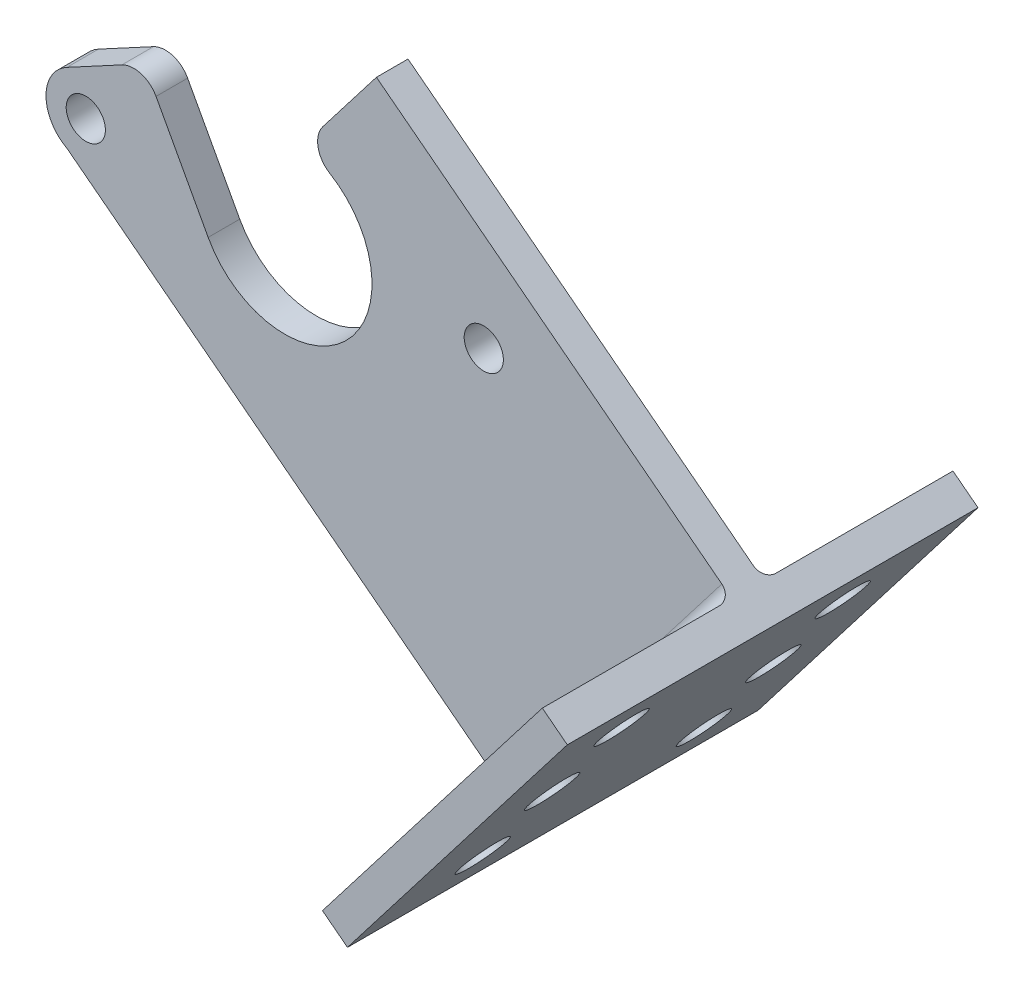
ISO-10303-21;
HEADER;
FILE_DESCRIPTION(('STEP AP214'),'2;1');
FILE_NAME('part.step','',(''),(''),'','','');
FILE_SCHEMA(('AUTOMOTIVE_DESIGN { 1 0 10303 214 1 1 1 1 }'));
ENDSEC;
DATA;
#1=APPLICATION_CONTEXT('core data for automotive mechanical design processes');
#2=APPLICATION_PROTOCOL_DEFINITION('international standard','automotive_design',2000,#1);
#3=PRODUCT_CONTEXT('',#1,'mechanical');
#4=PRODUCT('Part','Part','',(#3));
#5=PRODUCT_RELATED_PRODUCT_CATEGORY('part','',(#4));
#6=PRODUCT_DEFINITION_FORMATION('','',#4);
#7=PRODUCT_DEFINITION_CONTEXT('part definition',#1,'design');
#8=PRODUCT_DEFINITION('design','',#6,#7);
#9=PRODUCT_DEFINITION_SHAPE('','',#8);
#10=(LENGTH_UNIT() NAMED_UNIT(*) SI_UNIT(.MILLI.,.METRE.));
#11=(NAMED_UNIT(*) PLANE_ANGLE_UNIT() SI_UNIT($,.RADIAN.));
#12=(NAMED_UNIT(*) SI_UNIT($,.STERADIAN.) SOLID_ANGLE_UNIT());
#13=UNCERTAINTY_MEASURE_WITH_UNIT(LENGTH_MEASURE(1.E-05),#10,'distance_accuracy_value','');
#14=(GEOMETRIC_REPRESENTATION_CONTEXT(3) GLOBAL_UNCERTAINTY_ASSIGNED_CONTEXT((#13)) GLOBAL_UNIT_ASSIGNED_CONTEXT((#10,
#11,#12)) REPRESENTATION_CONTEXT('',''));
#15=CARTESIAN_POINT('',(0.,0.,0.));
#16=DIRECTION('',(0.,0.,1.));
#17=DIRECTION('',(1.,0.,0.));
#18=AXIS2_PLACEMENT_3D('',#15,#16,#17);
#19=CARTESIAN_POINT('',(0.,0.,0.));
#20=DIRECTION('',(0.,0.,1.));
#21=DIRECTION('',(1.,0.,0.));
#22=AXIS2_PLACEMENT_3D('',#19,#20,#21);
#23=PLANE('',#22);
#24=CARTESIAN_POINT('',(38.5758616292975,0.498338517345993,0.));
#25=DIRECTION('',(0.,0.,1.));
#26=DIRECTION('',(1.,0.,0.));
#27=AXIS2_PLACEMENT_3D('',#24,#25,#26);
#28=CIRCLE('',#27,3.93699999999999);
#29=CARTESIAN_POINT('',(42.5128616292975,0.498338517345993,0.));
#30=VERTEX_POINT('',#29);
#31=EDGE_CURVE('E266',#30,#30,#28,.T.);
#32=ORIENTED_EDGE('',*,*,#31,.T.);
#33=EDGE_LOOP('',(#32));
#34=FACE_BOUND('',#33,.T.);
#35=CARTESIAN_POINT('',(-41.4241383707025,0.498338517345993,0.));
#36=DIRECTION('',(0.,0.,1.));
#37=DIRECTION('',(1.,0.,0.));
#38=AXIS2_PLACEMENT_3D('',#35,#36,#37);
#39=CIRCLE('',#38,3.93699999999999);
#40=CARTESIAN_POINT('',(-37.4871383707025,0.498338517345993,0.));
#41=VERTEX_POINT('',#40);
#42=EDGE_CURVE('E238',#41,#41,#39,.T.);
#43=ORIENTED_EDGE('',*,*,#42,.T.);
#44=EDGE_LOOP('',(#43));
#45=FACE_BOUND('',#44,.T.);
#46=DIRECTION('',(-0.880294579810497,-0.474427500000012,0.));
#47=VECTOR('',#46,1.);
#48=CARTESIAN_POINT('',(-13.3273493271376,24.7287380599144,0.));
#49=LINE('',#48,#47);
#50=CARTESIAN_POINT('',(-34.1798728372739,13.4904425796274,0.));
#51=VERTEX_POINT('',#50);
#52=CARTESIAN_POINT('',(-45.2195583708478,7.54069515575112,0.));
#53=VERTEX_POINT('',#52);
#54=EDGE_CURVE('E274',#51,#53,#49,.T.);
#55=ORIENTED_EDGE('',*,*,#54,.F.);
#56=CARTESIAN_POINT('',(-31.7697811372739,9.01854611419009,0.));
#57=DIRECTION('',(0.,0.,1.));
#58=DIRECTION('',(1.,0.,0.));
#59=AXIS2_PLACEMENT_3D('',#56,#57,#58);
#60=CIRCLE('',#59,5.08);
#61=CARTESIAN_POINT('',(-27.3050347494882,11.4418578342862,0.));
#62=VERTEX_POINT('',#61);
#63=EDGE_CURVE('E318',#51,#62,#60,.F.);
#64=ORIENTED_EDGE('',*,*,#63,.T.);
#65=DIRECTION('',(0.477029866160642,-0.878887084209775,0.));
#66=VECTOR('',#65,1.);
#67=CARTESIAN_POINT('',(-16.2945089424224,-8.84410245594399,0.));
#68=LINE('',#67,#66);
#69=CARTESIAN_POINT('',(-16.827513408563,-7.86208691698541,0.));
#70=VERTEX_POINT('',#69);
#71=EDGE_CURVE('E272',#62,#70,#68,.T.);
#72=ORIENTED_EDGE('',*,*,#71,.T.);
#73=CARTESIAN_POINT('',(-1.42413837070245,0.498338517345993,0.));
#74=DIRECTION('',(0.,0.,1.));
#75=DIRECTION('',(1.,0.,0.));
#76=AXIS2_PLACEMENT_3D('',#73,#74,#75);
#77=CIRCLE('',#76,17.526);
#78=CARTESIAN_POINT('',(7.63050574043019,15.5041405958998,0.));
#79=VERTEX_POINT('',#78);
#80=EDGE_CURVE('E269',#70,#79,#77,.T.);
#81=ORIENTED_EDGE('',*,*,#80,.T.);
#82=CARTESIAN_POINT('',(10.2550402653962,19.853648444756,0.));
#83=DIRECTION('',(0.,0.,1.));
#84=DIRECTION('',(1.,0.,0.));
#85=AXIS2_PLACEMENT_3D('',#82,#83,#84);
#86=CIRCLE('',#85,5.08);
#87=CARTESIAN_POINT('',(6.23095521680817,22.9541547778782,0.));
#88=VERTEX_POINT('',#87);
#89=EDGE_CURVE('E316',#79,#88,#86,.F.);
#90=ORIENTED_EDGE('',*,*,#89,.T.);
#91=DIRECTION('',(-0.610335892346878,-0.7921427261,0.));
#92=VECTOR('',#91,1.);
#93=CARTESIAN_POINT('',(-7.18785452859849,5.53815046610413,0.));
#94=LINE('',#93,#92);
#95=CARTESIAN_POINT('',(16.9956413650065,36.9254252503648,0.));
#96=VERTEX_POINT('',#95);
#97=EDGE_CURVE('E244',#96,#88,#94,.T.);
#98=ORIENTED_EDGE('',*,*,#97,.F.);
#99=DIRECTION('',(-0.7921427261,0.610335892346878,0.));
#100=VECTOR('',#99,1.);
#101=CARTESIAN_POINT('',(24.183495893605,31.3872747842607,0.));
#102=LINE('',#101,#100);
#103=CARTESIAN_POINT('',(86.4282464584847,-16.571513611063,0.));
#104=VERTEX_POINT('',#103);
#105=EDGE_CURVE('E281',#104,#96,#102,.T.);
#106=ORIENTED_EDGE('',*,*,#105,.F.);
#107=DIRECTION('',(0.610335892346882,0.792142726099997,0.));
#108=VECTOR('',#107,1.);
#109=CARTESIAN_POINT('',(42.2361603573734,-73.9275367372342,0.));
#110=LINE('',#109,#108);
#111=CARTESIAN_POINT('',(42.2361603573734,-73.9275367372342,0.));
#112=VERTEX_POINT('',#111);
#113=EDGE_CURVE('E303',#104,#112,#110,.F.);
#114=ORIENTED_EDGE('',*,*,#113,.T.);
#115=DIRECTION('',(0.792142726099998,-0.610335892346882,0.));
#116=VECTOR('',#115,1.);
#117=CARTESIAN_POINT('',(-20.0085902075059,-25.9687483419104,0.));
#118=LINE('',#117,#116);
#119=CARTESIAN_POINT('',(-45.2195583708478,-6.54401812105913,0.));
#120=VERTEX_POINT('',#119);
#121=EDGE_CURVE('E279',#120,#112,#118,.T.);
#122=ORIENTED_EDGE('',*,*,#121,.F.);
#123=CARTESIAN_POINT('',(-41.4241383707025,0.498338517345993,0.));
#124=DIRECTION('',(0.,0.,1.));
#125=DIRECTION('',(1.,0.,0.));
#126=AXIS2_PLACEMENT_3D('',#123,#124,#125);
#127=CIRCLE('',#126,7.99999999999952);
#128=EDGE_CURVE('E276',#120,#53,#127,.F.);
#129=ORIENTED_EDGE('',*,*,#128,.T.);
#130=EDGE_LOOP('',(#55,#64,#72,#81,#90,#98,#106,#114,#122,#129));
#131=FACE_BOUND('',#130,.T.);
#132=ADVANCED_FACE('F45',(#34,#45,#131),#23,.F.);
#133=CARTESIAN_POINT('',(-1.42413837070245,0.498338517345993,6.35));
#134=DIRECTION('',(0.,0.,-1.));
#135=DIRECTION('',(-1.,0.,0.));
#136=AXIS2_PLACEMENT_3D('',#133,#134,#135);
#137=CYLINDRICAL_SURFACE('',#136,17.526);
#138=CARTESIAN_POINT('',(-1.42413837070245,0.498338517345993,6.35));
#139=DIRECTION('',(0.,0.,1.));
#140=DIRECTION('',(1.,0.,0.));
#141=AXIS2_PLACEMENT_3D('',#138,#139,#140);
#142=CIRCLE('',#141,17.526);
#143=CARTESIAN_POINT('',(-16.827513408563,-7.86208691698541,6.35));
#144=VERTEX_POINT('',#143);
#145=CARTESIAN_POINT('',(7.63050574043019,15.5041405958998,6.35));
#146=VERTEX_POINT('',#145);
#147=EDGE_CURVE('E247',#144,#146,#142,.T.);
#148=ORIENTED_EDGE('',*,*,#147,.T.);
#149=DIRECTION('',(0.,0.,-1.));
#150=VECTOR('',#149,1.);
#151=CARTESIAN_POINT('',(7.63050574043019,15.5041405958998,6.35));
#152=LINE('',#151,#150);
#153=EDGE_CURVE('E53',#146,#79,#152,.T.);
#154=ORIENTED_EDGE('',*,*,#153,.T.);
#155=ORIENTED_EDGE('',*,*,#80,.F.);
#156=DIRECTION('',(0.,0.,-1.));
#157=VECTOR('',#156,1.);
#158=CARTESIAN_POINT('',(-16.827513408563,-7.86208691698541,6.35));
#159=LINE('',#158,#157);
#160=EDGE_CURVE('E294',#144,#70,#159,.T.);
#161=ORIENTED_EDGE('',*,*,#160,.F.);
#162=EDGE_LOOP('',(#148,#154,#155,#161));
#163=FACE_BOUND('',#162,.T.);
#164=ADVANCED_FACE('F328',(#163),#137,.F.);
#165=CARTESIAN_POINT('',(-16.2945089424224,-8.84410245594399,6.35));
#166=DIRECTION('',(0.878887084209775,0.477029866160642,0.));
#167=DIRECTION('',(-0.477029866160642,0.878887084209775,0.));
#168=AXIS2_PLACEMENT_3D('',#165,#166,#167);
#169=PLANE('',#168);
#170=ORIENTED_EDGE('',*,*,#71,.F.);
#171=DIRECTION('',(0.,0.,-1.));
#172=VECTOR('',#171,1.);
#173=CARTESIAN_POINT('',(-27.3050347494882,11.4418578342861,6.35));
#174=LINE('',#173,#172);
#175=CARTESIAN_POINT('',(-27.3050347494882,11.4418578342862,6.35));
#176=VERTEX_POINT('',#175);
#177=EDGE_CURVE('E320',#62,#176,#174,.F.);
#178=ORIENTED_EDGE('',*,*,#177,.T.);
#179=DIRECTION('',(0.477029866160642,-0.878887084209775,0.));
#180=VECTOR('',#179,1.);
#181=CARTESIAN_POINT('',(-16.2945089424224,-8.84410245594399,6.35));
#182=LINE('',#181,#180);
#183=EDGE_CURVE('E249',#176,#144,#182,.T.);
#184=ORIENTED_EDGE('',*,*,#183,.T.);
#185=ORIENTED_EDGE('',*,*,#160,.T.);
#186=EDGE_LOOP('',(#170,#178,#184,#185));
#187=FACE_BOUND('',#186,.T.);
#188=ADVANCED_FACE('F337',(#187),#169,.T.);
#189=CARTESIAN_POINT('',(-13.3273493271376,24.7287380599144,6.35));
#190=DIRECTION('',(0.474427500000012,-0.880294579810497,0.));
#191=DIRECTION('',(0.880294579810497,0.474427500000012,0.));
#192=AXIS2_PLACEMENT_3D('',#189,#190,#191);
#193=PLANE('',#192);
#194=DIRECTION('',(-0.880294579810497,-0.474427500000012,0.));
#195=VECTOR('',#194,1.);
#196=CARTESIAN_POINT('',(-13.3273493271376,24.7287380599144,6.35));
#197=LINE('',#196,#195);
#198=CARTESIAN_POINT('',(-34.1798728372739,13.4904425796274,6.35));
#199=VERTEX_POINT('',#198);
#200=CARTESIAN_POINT('',(-45.2195583708478,7.54069515575112,6.35));
#201=VERTEX_POINT('',#200);
#202=EDGE_CURVE('E251',#199,#201,#197,.T.);
#203=ORIENTED_EDGE('',*,*,#202,.F.);
#204=DIRECTION('',(0.,0.,-1.));
#205=VECTOR('',#204,1.);
#206=CARTESIAN_POINT('',(-34.1798728372739,13.4904425796274,0.));
#207=LINE('',#206,#205);
#208=EDGE_CURVE('E313',#199,#51,#207,.T.);
#209=ORIENTED_EDGE('',*,*,#208,.T.);
#210=ORIENTED_EDGE('',*,*,#54,.T.);
#211=DIRECTION('',(0.,0.,-1.));
#212=VECTOR('',#211,1.);
#213=CARTESIAN_POINT('',(-45.2195583708478,7.54069515575112,6.35));
#214=LINE('',#213,#212);
#215=EDGE_CURVE('E291',#201,#53,#214,.T.);
#216=ORIENTED_EDGE('',*,*,#215,.F.);
#217=EDGE_LOOP('',(#203,#209,#210,#216));
#218=FACE_BOUND('',#217,.T.);
#219=ADVANCED_FACE('F347',(#218),#193,.F.);
#220=CARTESIAN_POINT('',(-41.4241383707025,0.498338517345993,6.35));
#221=DIRECTION('',(0.,0.,-1.));
#222=DIRECTION('',(-1.,0.,0.));
#223=AXIS2_PLACEMENT_3D('',#220,#221,#222);
#224=CYLINDRICAL_SURFACE('',#223,7.99999999999952);
#225=ORIENTED_EDGE('',*,*,#128,.F.);
#226=DIRECTION('',(0.,0.,-1.));
#227=VECTOR('',#226,1.);
#228=CARTESIAN_POINT('',(-45.2195583708478,-6.54401812105913,6.35));
#229=LINE('',#228,#227);
#230=CARTESIAN_POINT('',(-45.2195583708478,-6.54401812105913,6.35));
#231=VERTEX_POINT('',#230);
#232=EDGE_CURVE('E289',#231,#120,#229,.T.);
#233=ORIENTED_EDGE('',*,*,#232,.F.);
#234=CARTESIAN_POINT('',(-41.4241383707025,0.498338517345993,6.35));
#235=DIRECTION('',(0.,0.,1.));
#236=DIRECTION('',(1.,0.,0.));
#237=AXIS2_PLACEMENT_3D('',#234,#235,#236);
#238=CIRCLE('',#237,7.99999999999952);
#239=EDGE_CURVE('E253',#231,#201,#238,.F.);
#240=ORIENTED_EDGE('',*,*,#239,.T.);
#241=ORIENTED_EDGE('',*,*,#215,.T.);
#242=EDGE_LOOP('',(#225,#233,#240,#241));
#243=FACE_BOUND('',#242,.T.);
#244=ADVANCED_FACE('F352',(#243),#224,.T.);
#245=CARTESIAN_POINT('',(-20.0085902075059,-25.9687483419104,6.35));
#246=DIRECTION('',(0.610335892346882,0.792142726099997,0.));
#247=DIRECTION('',(-0.792142726099997,0.610335892346882,0.));
#248=AXIS2_PLACEMENT_3D('',#245,#246,#247);
#249=PLANE('',#248);
#250=ORIENTED_EDGE('',*,*,#121,.T.);
#251=CARTESIAN_POINT('',(42.2361603573734,-73.9275367372342,-2.54));
#252=DIRECTION('',(0.610335892346882,0.792142726099997,0.));
#253=DIRECTION('',(-0.792142726099997,0.610335892346882,0.));
#254=AXIS2_PLACEMENT_3D('',#251,#252,#253);
#255=CIRCLE('',#254,2.54);
#256=CARTESIAN_POINT('',(44.2482028816674,-75.4777899037952,-2.54));
#257=VERTEX_POINT('',#256);
#258=EDGE_CURVE('E311',#112,#257,#255,.T.);
#259=ORIENTED_EDGE('',*,*,#258,.T.);
#260=DIRECTION('',(0.,0.,1.));
#261=VECTOR('',#260,1.);
#262=CARTESIAN_POINT('',(44.2482028816674,-75.4777899037952,0.));
#263=LINE('',#262,#261);
#264=CARTESIAN_POINT('',(44.2482028816674,-75.4777899037952,-38.1));
#265=VERTEX_POINT('',#264);
#266=EDGE_CURVE('E210',#265,#257,#263,.T.);
#267=ORIENTED_EDGE('',*,*,#266,.F.);
#268=DIRECTION('',(0.792142726099997,-0.610335892346882,0.));
#269=VECTOR('',#268,1.);
#270=CARTESIAN_POINT('',(44.2482028816674,-75.4777899037952,-38.1));
#271=LINE('',#270,#269);
#272=CARTESIAN_POINT('',(49.2783091924024,-79.3534228201979,-38.1));
#273=VERTEX_POINT('',#272);
#274=EDGE_CURVE('E224',#265,#273,#271,.T.);
#275=ORIENTED_EDGE('',*,*,#274,.T.);
#276=DIRECTION('',(0.,0.,-1.));
#277=VECTOR('',#276,1.);
#278=CARTESIAN_POINT('',(49.2783091924024,-79.3534228201979,6.35));
#279=LINE('',#278,#277);
#280=CARTESIAN_POINT('',(49.2783091924024,-79.3534228201979,44.45));
#281=VERTEX_POINT('',#280);
#282=EDGE_CURVE('E165',#281,#273,#279,.T.);
#283=ORIENTED_EDGE('',*,*,#282,.F.);
#284=DIRECTION('',(0.792142726099997,-0.610335892346882,0.));
#285=VECTOR('',#284,1.);
#286=CARTESIAN_POINT('',(44.2482028816674,-75.4777899037952,44.45));
#287=LINE('',#286,#285);
#288=CARTESIAN_POINT('',(44.2482028816674,-75.4777899037952,44.45));
#289=VERTEX_POINT('',#288);
#290=EDGE_CURVE('E159',#289,#281,#287,.T.);
#291=ORIENTED_EDGE('',*,*,#290,.F.);
#292=DIRECTION('',(0.,0.,-1.));
#293=VECTOR('',#292,1.);
#294=CARTESIAN_POINT('',(44.2482028816674,-75.4777899037952,0.));
#295=LINE('',#294,#293);
#296=CARTESIAN_POINT('',(44.2482028816674,-75.4777899037952,8.89));
#297=VERTEX_POINT('',#296);
#298=EDGE_CURVE('E163',#289,#297,#295,.T.);
#299=ORIENTED_EDGE('',*,*,#298,.T.);
#300=CARTESIAN_POINT('',(42.2361603573734,-73.9275367372342,8.89));
#301=DIRECTION('',(0.610335892346882,0.792142726099997,0.));
#302=DIRECTION('',(-0.792142726099997,0.610335892346882,0.));
#303=AXIS2_PLACEMENT_3D('',#300,#301,#302);
#304=CIRCLE('',#303,2.54);
#305=CARTESIAN_POINT('',(42.2361603573734,-73.9275367372342,6.35));
#306=VERTEX_POINT('',#305);
#307=EDGE_CURVE('E305',#297,#306,#304,.T.);
#308=ORIENTED_EDGE('',*,*,#307,.T.);
#309=DIRECTION('',(0.792142726099998,-0.610335892346882,0.));
#310=VECTOR('',#309,1.);
#311=CARTESIAN_POINT('',(-20.0085902075059,-25.9687483419104,6.35));
#312=LINE('',#311,#310);
#313=EDGE_CURVE('E256',#231,#306,#312,.T.);
#314=ORIENTED_EDGE('',*,*,#313,.F.);
#315=ORIENTED_EDGE('',*,*,#232,.T.);
#316=EDGE_LOOP('',(#250,#259,#267,#275,#283,#291,#299,#308,#314,#315));
#317=FACE_BOUND('',#316,.T.);
#318=ADVANCED_FACE('F162',(#317),#249,.F.);
#319=CARTESIAN_POINT('',(69.2868993999083,-53.3846744782876,6.35));
#320=DIRECTION('',(-0.792142726099997,0.610335892346882,0.));
#321=DIRECTION('',(-0.610335892346882,-0.792142726099997,0.));
#322=AXIS2_PLACEMENT_3D('',#319,#320,#321);
#323=PLANE('',#322);
#324=ORIENTED_EDGE('',*,*,#282,.T.);
#325=DIRECTION('',(-0.610335892346882,-0.792142726099997,0.));
#326=VECTOR('',#325,1.);
#327=CARTESIAN_POINT('',(69.2868993999083,-53.3846744782876,-38.1));
#328=LINE('',#327,#326);
#329=CARTESIAN_POINT('',(93.4703952935137,-21.9973996940268,-38.1));
#330=VERTEX_POINT('',#329);
#331=EDGE_CURVE('E227',#330,#273,#328,.T.);
#332=ORIENTED_EDGE('',*,*,#331,.F.);
#333=DIRECTION('',(0.,0.,-1.));
#334=VECTOR('',#333,1.);
#335=CARTESIAN_POINT('',(93.4703952935134,-21.9973996940265,6.35));
#336=LINE('',#335,#334);
#337=CARTESIAN_POINT('',(93.4703952935137,-21.9973996940268,44.45));
#338=VERTEX_POINT('',#337);
#339=EDGE_CURVE('E286',#338,#330,#336,.T.);
#340=ORIENTED_EDGE('',*,*,#339,.F.);
#341=DIRECTION('',(-0.610335892346882,-0.792142726099997,0.));
#342=VECTOR('',#341,1.);
#343=CARTESIAN_POINT('',(69.2868993999083,-53.3846744782876,44.45));
#344=LINE('',#343,#342);
#345=EDGE_CURVE('E202',#338,#281,#344,.T.);
#346=ORIENTED_EDGE('',*,*,#345,.T.);
#347=EDGE_LOOP('',(#324,#332,#340,#346));
#348=FACE_BOUND('',#347,.T.);
#349=CARTESIAN_POINT('',(85.3266307420078,-32.5670285384664,-19.05));
#350=DIRECTION('',(0.792142726099997,-0.610335892346882,0.));
#351=DIRECTION('',(0.610335892346882,0.792142726099997,0.));
#352=AXIS2_PLACEMENT_3D('',#349,#350,#351);
#353=CIRCLE('',#352,4.7625);
#354=CARTESIAN_POINT('',(88.2333554293098,-28.7944488054152,-19.05));
#355=VERTEX_POINT('',#354);
#356=EDGE_CURVE('E205',#355,#355,#353,.F.);
#357=ORIENTED_EDGE('',*,*,#356,.T.);
#358=EDGE_LOOP('',(#357));
#359=FACE_BOUND('',#358,.T.);
#360=CARTESIAN_POINT('',(57.4220737439084,-68.7837939757583,-19.05));
#361=DIRECTION('',(0.792142726099997,-0.610335892346882,0.));
#362=DIRECTION('',(0.610335892346882,0.792142726099997,0.));
#363=AXIS2_PLACEMENT_3D('',#360,#361,#362);
#364=CIRCLE('',#363,4.7625);
#365=CARTESIAN_POINT('',(60.3287984312104,-65.0112142427071,-19.05));
#366=VERTEX_POINT('',#365);
#367=EDGE_CURVE('E230',#366,#366,#364,.F.);
#368=ORIENTED_EDGE('',*,*,#367,.T.);
#369=EDGE_LOOP('',(#368));
#370=FACE_BOUND('',#369,.T.);
#371=CARTESIAN_POINT('',(71.3743522429581,-50.6754112571124,-19.05));
#372=DIRECTION('',(0.792142726099997,-0.610335892346882,0.));
#373=DIRECTION('',(0.610335892346882,0.792142726099997,0.));
#374=AXIS2_PLACEMENT_3D('',#371,#372,#373);
#375=CIRCLE('',#374,4.7625);
#376=CARTESIAN_POINT('',(74.2810769302601,-46.9028315240611,-19.05));
#377=VERTEX_POINT('',#376);
#378=EDGE_CURVE('E211',#377,#377,#375,.F.);
#379=ORIENTED_EDGE('',*,*,#378,.T.);
#380=EDGE_LOOP('',(#379));
#381=FACE_BOUND('',#380,.T.);
#382=CARTESIAN_POINT('',(57.4220737439084,-68.7837939757583,25.4));
#383=DIRECTION('',(0.792142726099997,-0.610335892346882,0.));
#384=DIRECTION('',(0.610335892346882,0.792142726099997,0.));
#385=AXIS2_PLACEMENT_3D('',#382,#383,#384);
#386=CIRCLE('',#385,4.7625);
#387=CARTESIAN_POINT('',(60.3287984312104,-65.0112142427071,25.4));
#388=VERTEX_POINT('',#387);
#389=EDGE_CURVE('E193',#388,#388,#386,.T.);
#390=ORIENTED_EDGE('',*,*,#389,.F.);
#391=EDGE_LOOP('',(#390));
#392=FACE_BOUND('',#391,.T.);
#393=CARTESIAN_POINT('',(85.3266307420078,-32.5670285384664,25.4));
#394=DIRECTION('',(0.792142726099997,-0.610335892346882,0.));
#395=DIRECTION('',(0.610335892346882,0.792142726099997,0.));
#396=AXIS2_PLACEMENT_3D('',#393,#394,#395);
#397=CIRCLE('',#396,4.7625);
#398=CARTESIAN_POINT('',(88.2333554293098,-28.7944488054152,25.4));
#399=VERTEX_POINT('',#398);
#400=EDGE_CURVE('E196',#399,#399,#397,.T.);
#401=ORIENTED_EDGE('',*,*,#400,.F.);
#402=EDGE_LOOP('',(#401));
#403=FACE_BOUND('',#402,.T.);
#404=CARTESIAN_POINT('',(71.3743522429581,-50.6754112571124,25.4));
#405=DIRECTION('',(0.792142726099997,-0.610335892346882,0.));
#406=DIRECTION('',(0.610335892346882,0.792142726099997,0.));
#407=AXIS2_PLACEMENT_3D('',#404,#405,#406);
#408=CIRCLE('',#407,4.7625);
#409=CARTESIAN_POINT('',(74.2810769302601,-46.9028315240611,25.4));
#410=VERTEX_POINT('',#409);
#411=EDGE_CURVE('E199',#410,#410,#408,.T.);
#412=ORIENTED_EDGE('',*,*,#411,.F.);
#413=EDGE_LOOP('',(#412));
#414=FACE_BOUND('',#413,.T.);
#415=ADVANCED_FACE('F388',(#348,#359,#370,#381,#392,#403,#414),#323,.F.);
#416=CARTESIAN_POINT('',(24.183495893605,31.3872747842607,6.35));
#417=DIRECTION('',(-0.610335892346878,-0.7921427261,0.));
#418=DIRECTION('',(0.7921427261,-0.610335892346878,0.));
#419=AXIS2_PLACEMENT_3D('',#416,#417,#418);
#420=PLANE('',#419);
#421=ORIENTED_EDGE('',*,*,#339,.T.);
#422=DIRECTION('',(0.792142726099997,-0.610335892346882,0.));
#423=VECTOR('',#422,1.);
#424=CARTESIAN_POINT('',(88.4402889827787,-18.1217667776241,-38.1));
#425=LINE('',#424,#423);
#426=CARTESIAN_POINT('',(88.4402889827787,-18.1217667776241,-38.1));
#427=VERTEX_POINT('',#426);
#428=EDGE_CURVE('E235',#427,#330,#425,.T.);
#429=ORIENTED_EDGE('',*,*,#428,.F.);
#430=DIRECTION('',(0.,0.,-1.));
#431=VECTOR('',#430,1.);
#432=CARTESIAN_POINT('',(88.4402889827787,-18.1217667776241,0.));
#433=LINE('',#432,#431);
#434=CARTESIAN_POINT('',(88.4402889827787,-18.1217667776241,-2.54));
#435=VERTEX_POINT('',#434);
#436=EDGE_CURVE('E216',#435,#427,#433,.T.);
#437=ORIENTED_EDGE('',*,*,#436,.F.);
#438=CARTESIAN_POINT('',(86.4282464584847,-16.571513611063,-2.54));
#439=DIRECTION('',(-0.610335892346878,-0.7921427261,0.));
#440=DIRECTION('',(0.7921427261,-0.610335892346878,0.));
#441=AXIS2_PLACEMENT_3D('',#438,#439,#440);
#442=CIRCLE('',#441,2.54);
#443=EDGE_CURVE('E309',#435,#104,#442,.T.);
#444=ORIENTED_EDGE('',*,*,#443,.T.);
#445=ORIENTED_EDGE('',*,*,#105,.T.);
#446=DIRECTION('',(0.,0.,-1.));
#447=VECTOR('',#446,1.);
#448=CARTESIAN_POINT('',(16.9956413650065,36.9254252503648,6.35));
#449=LINE('',#448,#447);
#450=CARTESIAN_POINT('',(16.9956413650065,36.9254252503648,6.35));
#451=VERTEX_POINT('',#450);
#452=EDGE_CURVE('E263',#451,#96,#449,.T.);
#453=ORIENTED_EDGE('',*,*,#452,.F.);
#454=DIRECTION('',(-0.7921427261,0.610335892346878,0.));
#455=VECTOR('',#454,1.);
#456=CARTESIAN_POINT('',(24.183495893605,31.3872747842607,6.35));
#457=LINE('',#456,#455);
#458=CARTESIAN_POINT('',(86.4282464584847,-16.571513611063,6.35));
#459=VERTEX_POINT('',#458);
#460=EDGE_CURVE('E259',#459,#451,#457,.T.);
#461=ORIENTED_EDGE('',*,*,#460,.F.);
#462=CARTESIAN_POINT('',(86.4282464584847,-16.571513611063,8.89));
#463=DIRECTION('',(-0.610335892346878,-0.7921427261,0.));
#464=DIRECTION('',(0.7921427261,-0.610335892346878,0.));
#465=AXIS2_PLACEMENT_3D('',#462,#463,#464);
#466=CIRCLE('',#465,2.54);
#467=CARTESIAN_POINT('',(88.4402889827787,-18.1217667776241,8.89));
#468=VERTEX_POINT('',#467);
#469=EDGE_CURVE('E307',#459,#468,#466,.T.);
#470=ORIENTED_EDGE('',*,*,#469,.T.);
#471=DIRECTION('',(0.,0.,1.));
#472=VECTOR('',#471,1.);
#473=CARTESIAN_POINT('',(88.4402889827787,-18.1217667776241,0.));
#474=LINE('',#473,#472);
#475=CARTESIAN_POINT('',(88.4402889827787,-18.1217667776241,44.45));
#476=VERTEX_POINT('',#475);
#477=EDGE_CURVE('E171',#468,#476,#474,.T.);
#478=ORIENTED_EDGE('',*,*,#477,.T.);
#479=DIRECTION('',(0.792142726099997,-0.610335892346882,0.));
#480=VECTOR('',#479,1.);
#481=CARTESIAN_POINT('',(88.4402889827787,-18.1217667776241,44.45));
#482=LINE('',#481,#480);
#483=EDGE_CURVE('E170',#476,#338,#482,.T.);
#484=ORIENTED_EDGE('',*,*,#483,.T.);
#485=EDGE_LOOP('',(#421,#429,#437,#444,#445,#453,#461,#470,#478,#484));
#486=FACE_BOUND('',#485,.T.);
#487=ADVANCED_FACE('F361',(#486),#420,.F.);
#488=CARTESIAN_POINT('',(38.5758616292975,0.498338517345993,6.35));
#489=DIRECTION('',(0.,0.,-1.));
#490=DIRECTION('',(-1.,0.,0.));
#491=AXIS2_PLACEMENT_3D('',#488,#489,#490);
#492=CYLINDRICAL_SURFACE('',#491,3.93699999999999);
#493=CARTESIAN_POINT('',(38.5758616292975,0.498338517345993,6.35));
#494=DIRECTION('',(0.,0.,1.));
#495=DIRECTION('',(1.,0.,0.));
#496=AXIS2_PLACEMENT_3D('',#493,#494,#495);
#497=CIRCLE('',#496,3.93699999999999);
#498=CARTESIAN_POINT('',(42.5128616292975,0.498338517345993,6.35));
#499=VERTEX_POINT('',#498);
#500=EDGE_CURVE('E243',#499,#499,#497,.T.);
#501=ORIENTED_EDGE('',*,*,#500,.T.);
#502=EDGE_LOOP('',(#501));
#503=FACE_BOUND('',#502,.T.);
#504=ORIENTED_EDGE('',*,*,#31,.F.);
#505=EDGE_LOOP('',(#504));
#506=FACE_BOUND('',#505,.T.);
#507=ADVANCED_FACE('F387',(#503,#506),#492,.F.);
#508=CARTESIAN_POINT('',(-41.4241383707025,0.498338517345993,6.35));
#509=DIRECTION('',(0.,0.,-1.));
#510=DIRECTION('',(-1.,0.,0.));
#511=AXIS2_PLACEMENT_3D('',#508,#509,#510);
#512=CYLINDRICAL_SURFACE('',#511,3.93699999999999);
#513=CARTESIAN_POINT('',(-41.4241383707025,0.498338517345993,6.35));
#514=DIRECTION('',(0.,0.,1.));
#515=DIRECTION('',(1.,0.,0.));
#516=AXIS2_PLACEMENT_3D('',#513,#514,#515);
#517=CIRCLE('',#516,3.93699999999999);
#518=CARTESIAN_POINT('',(-37.4871383707025,0.498338517345993,6.35));
#519=VERTEX_POINT('',#518);
#520=EDGE_CURVE('E240',#519,#519,#517,.T.);
#521=ORIENTED_EDGE('',*,*,#520,.T.);
#522=EDGE_LOOP('',(#521));
#523=FACE_BOUND('',#522,.T.);
#524=ORIENTED_EDGE('',*,*,#42,.F.);
#525=EDGE_LOOP('',(#524));
#526=FACE_BOUND('',#525,.T.);
#527=ADVANCED_FACE('F384',(#523,#526),#512,.F.);
#528=CARTESIAN_POINT('',(-7.18785452859849,5.53815046610413,6.35));
#529=DIRECTION('',(0.7921427261,-0.610335892346878,0.));
#530=DIRECTION('',(0.610335892346878,0.7921427261,0.));
#531=AXIS2_PLACEMENT_3D('',#528,#529,#530);
#532=PLANE('',#531);
#533=ORIENTED_EDGE('',*,*,#97,.T.);
#534=DIRECTION('',(0.,0.,1.));
#535=VECTOR('',#534,1.);
#536=CARTESIAN_POINT('',(6.23095521680817,22.9541547778782,6.35));
#537=LINE('',#536,#535);
#538=CARTESIAN_POINT('',(6.23095521680817,22.9541547778782,6.35));
#539=VERTEX_POINT('',#538);
#540=EDGE_CURVE('E11',#88,#539,#537,.T.);
#541=ORIENTED_EDGE('',*,*,#540,.T.);
#542=DIRECTION('',(-0.610335892346878,-0.7921427261,0.));
#543=VECTOR('',#542,1.);
#544=CARTESIAN_POINT('',(-7.18785452859849,5.53815046610413,6.35));
#545=LINE('',#544,#543);
#546=EDGE_CURVE('E261',#451,#539,#545,.T.);
#547=ORIENTED_EDGE('',*,*,#546,.F.);
#548=ORIENTED_EDGE('',*,*,#452,.T.);
#549=EDGE_LOOP('',(#533,#541,#547,#548));
#550=FACE_BOUND('',#549,.T.);
#551=ADVANCED_FACE('F363',(#550),#532,.F.);
#552=CARTESIAN_POINT('',(0.,0.,6.35));
#553=DIRECTION('',(0.,0.,1.));
#554=DIRECTION('',(1.,0.,0.));
#555=AXIS2_PLACEMENT_3D('',#552,#553,#554);
#556=PLANE('',#555);
#557=ORIENTED_EDGE('',*,*,#183,.F.);
#558=CARTESIAN_POINT('',(-31.7697811372739,9.01854611419009,6.35));
#559=DIRECTION('',(0.,0.,1.));
#560=DIRECTION('',(1.,0.,0.));
#561=AXIS2_PLACEMENT_3D('',#558,#559,#560);
#562=CIRCLE('',#561,5.08);
#563=EDGE_CURVE('E323',#176,#199,#562,.T.);
#564=ORIENTED_EDGE('',*,*,#563,.T.);
#565=ORIENTED_EDGE('',*,*,#202,.T.);
#566=ORIENTED_EDGE('',*,*,#239,.F.);
#567=ORIENTED_EDGE('',*,*,#313,.T.);
#568=DIRECTION('',(-0.610335892346882,-0.792142726099997,0.));
#569=VECTOR('',#568,1.);
#570=CARTESIAN_POINT('',(62.2447505648793,-47.9587883953238,6.35));
#571=LINE('',#570,#569);
#572=EDGE_CURVE('E298',#306,#459,#571,.F.);
#573=ORIENTED_EDGE('',*,*,#572,.T.);
#574=ORIENTED_EDGE('',*,*,#460,.T.);
#575=ORIENTED_EDGE('',*,*,#546,.T.);
#576=CARTESIAN_POINT('',(10.2550402653962,19.853648444756,6.35));
#577=DIRECTION('',(0.,0.,1.));
#578=DIRECTION('',(1.,0.,0.));
#579=AXIS2_PLACEMENT_3D('',#576,#577,#578);
#580=CIRCLE('',#579,5.08);
#581=EDGE_CURVE('E60',#539,#146,#580,.T.);
#582=ORIENTED_EDGE('',*,*,#581,.T.);
#583=ORIENTED_EDGE('',*,*,#147,.F.);
#584=EDGE_LOOP('',(#557,#564,#565,#566,#567,#573,#574,#575,#582,#583));
#585=FACE_BOUND('',#584,.T.);
#586=ORIENTED_EDGE('',*,*,#520,.F.);
#587=EDGE_LOOP('',(#586));
#588=FACE_BOUND('',#587,.T.);
#589=ORIENTED_EDGE('',*,*,#500,.F.);
#590=EDGE_LOOP('',(#589));
#591=FACE_BOUND('',#590,.T.);
#592=ADVANCED_FACE('F339',(#585,#588,#591),#556,.T.);
#593=CARTESIAN_POINT('',(52.3919674331734,-64.9081610593556,-19.05));
#594=DIRECTION('',(0.792142726099997,-0.610335892346882,0.));
#595=DIRECTION('',(0.610335892346882,0.792142726099997,0.));
#596=AXIS2_PLACEMENT_3D('',#593,#594,#595);
#597=CYLINDRICAL_SURFACE('',#596,4.7625);
#598=CARTESIAN_POINT('',(52.3919674331734,-64.9081610593556,-19.05));
#599=DIRECTION('',(0.792142726099997,-0.610335892346882,0.));
#600=DIRECTION('',(0.610335892346882,0.792142726099997,0.));
#601=AXIS2_PLACEMENT_3D('',#598,#599,#600);
#602=CIRCLE('',#601,4.7625);
#603=CARTESIAN_POINT('',(55.2986921204754,-61.1355813263043,-19.05));
#604=VERTEX_POINT('',#603);
#605=EDGE_CURVE('E218',#604,#604,#602,.F.);
#606=ORIENTED_EDGE('',*,*,#605,.T.);
#607=EDGE_LOOP('',(#606));
#608=FACE_BOUND('',#607,.T.);
#609=ORIENTED_EDGE('',*,*,#367,.F.);
#610=EDGE_LOOP('',(#609));
#611=FACE_BOUND('',#610,.T.);
#612=ADVANCED_FACE('F465',(#608,#611),#597,.F.);
#613=CARTESIAN_POINT('',(64.2567930891733,-49.5090415618849,-38.1));
#614=DIRECTION('',(0.,0.,1.));
#615=DIRECTION('',(1.,0.,0.));
#616=AXIS2_PLACEMENT_3D('',#613,#614,#615);
#617=PLANE('',#616);
#618=ORIENTED_EDGE('',*,*,#331,.T.);
#619=ORIENTED_EDGE('',*,*,#274,.F.);
#620=DIRECTION('',(-0.610335892346882,-0.792142726099997,0.));
#621=VECTOR('',#620,1.);
#622=CARTESIAN_POINT('',(64.2567930891733,-49.5090415618849,-38.1));
#623=LINE('',#622,#621);
#624=EDGE_CURVE('E214',#427,#265,#623,.T.);
#625=ORIENTED_EDGE('',*,*,#624,.F.);
#626=ORIENTED_EDGE('',*,*,#428,.T.);
#627=EDGE_LOOP('',(#618,#619,#625,#626));
#628=FACE_BOUND('',#627,.T.);
#629=ADVANCED_FACE('F423',(#628),#617,.F.);
#630=CARTESIAN_POINT('',(80.2965244312728,-28.6913956220637,-19.05));
#631=DIRECTION('',(0.792142726099997,-0.610335892346882,0.));
#632=DIRECTION('',(0.610335892346882,0.792142726099997,0.));
#633=AXIS2_PLACEMENT_3D('',#630,#631,#632);
#634=CYLINDRICAL_SURFACE('',#633,4.7625);
#635=CARTESIAN_POINT('',(80.2965244312728,-28.6913956220637,-19.05));
#636=DIRECTION('',(0.792142726099997,-0.610335892346882,0.));
#637=DIRECTION('',(0.610335892346882,0.792142726099997,0.));
#638=AXIS2_PLACEMENT_3D('',#635,#636,#637);
#639=CIRCLE('',#638,4.7625);
#640=CARTESIAN_POINT('',(83.2032491185748,-24.9188158890125,-19.05));
#641=VERTEX_POINT('',#640);
#642=EDGE_CURVE('E207',#641,#641,#639,.F.);
#643=ORIENTED_EDGE('',*,*,#642,.T.);
#644=EDGE_LOOP('',(#643));
#645=FACE_BOUND('',#644,.T.);
#646=ORIENTED_EDGE('',*,*,#356,.F.);
#647=EDGE_LOOP('',(#646));
#648=FACE_BOUND('',#647,.T.);
#649=ADVANCED_FACE('F463',(#645,#648),#634,.F.);
#650=CARTESIAN_POINT('',(66.3442459322231,-46.7997783407097,-19.05));
#651=DIRECTION('',(0.792142726099997,-0.610335892346882,0.));
#652=DIRECTION('',(0.610335892346882,0.792142726099997,0.));
#653=AXIS2_PLACEMENT_3D('',#650,#651,#652);
#654=CYLINDRICAL_SURFACE('',#653,4.7625);
#655=CARTESIAN_POINT('',(66.3442459322231,-46.7997783407097,-19.05));
#656=DIRECTION('',(0.792142726099997,-0.610335892346882,0.));
#657=DIRECTION('',(0.610335892346882,0.792142726099997,0.));
#658=AXIS2_PLACEMENT_3D('',#655,#656,#657);
#659=CIRCLE('',#658,4.7625);
#660=CARTESIAN_POINT('',(69.2509706195251,-43.0271986076584,-19.05));
#661=VERTEX_POINT('',#660);
#662=EDGE_CURVE('E221',#661,#661,#659,.F.);
#663=ORIENTED_EDGE('',*,*,#662,.T.);
#664=EDGE_LOOP('',(#663));
#665=FACE_BOUND('',#664,.T.);
#666=ORIENTED_EDGE('',*,*,#378,.F.);
#667=EDGE_LOOP('',(#666));
#668=FACE_BOUND('',#667,.T.);
#669=ADVANCED_FACE('F459',(#665,#668),#654,.F.);
#670=CARTESIAN_POINT('',(64.2567930891733,-49.5090415618849,0.));
#671=DIRECTION('',(0.792142726099997,-0.610335892346882,0.));
#672=DIRECTION('',(0.610335892346882,0.792142726099997,0.));
#673=AXIS2_PLACEMENT_3D('',#670,#671,#672);
#674=PLANE('',#673);
#675=ORIENTED_EDGE('',*,*,#642,.F.);
#676=EDGE_LOOP('',(#675));
#677=FACE_BOUND('',#676,.T.);
#678=ORIENTED_EDGE('',*,*,#266,.T.);
#679=DIRECTION('',(0.610335892346882,0.792142726099997,0.));
#680=VECTOR('',#679,1.);
#681=CARTESIAN_POINT('',(88.4402889827787,-18.1217667776241,-2.54));
#682=LINE('',#681,#680);
#683=EDGE_CURVE('E300',#257,#435,#682,.T.);
#684=ORIENTED_EDGE('',*,*,#683,.T.);
#685=ORIENTED_EDGE('',*,*,#436,.T.);
#686=ORIENTED_EDGE('',*,*,#624,.T.);
#687=EDGE_LOOP('',(#678,#684,#685,#686));
#688=FACE_BOUND('',#687,.T.);
#689=ORIENTED_EDGE('',*,*,#605,.F.);
#690=EDGE_LOOP('',(#689));
#691=FACE_BOUND('',#690,.T.);
#692=ORIENTED_EDGE('',*,*,#662,.F.);
#693=EDGE_LOOP('',(#692));
#694=FACE_BOUND('',#693,.T.);
#695=ADVANCED_FACE('F416',(#677,#688,#691,#694),#674,.F.);
#696=CARTESIAN_POINT('',(64.2567930891733,-49.5090415618849,44.45));
#697=DIRECTION('',(0.,0.,1.));
#698=DIRECTION('',(1.,0.,0.));
#699=AXIS2_PLACEMENT_3D('',#696,#697,#698);
#700=PLANE('',#699);
#701=ORIENTED_EDGE('',*,*,#345,.F.);
#702=ORIENTED_EDGE('',*,*,#483,.F.);
#703=DIRECTION('',(-0.610335892346882,-0.792142726099997,0.));
#704=VECTOR('',#703,1.);
#705=CARTESIAN_POINT('',(64.2567930891733,-49.5090415618849,44.45));
#706=LINE('',#705,#704);
#707=EDGE_CURVE('E178',#476,#289,#706,.T.);
#708=ORIENTED_EDGE('',*,*,#707,.T.);
#709=ORIENTED_EDGE('',*,*,#290,.T.);
#710=EDGE_LOOP('',(#701,#702,#708,#709));
#711=FACE_BOUND('',#710,.T.);
#712=ADVANCED_FACE('F183',(#711),#700,.T.);
#713=CARTESIAN_POINT('',(66.3442459322231,-46.7997783407097,25.4));
#714=DIRECTION('',(0.792142726099997,-0.610335892346882,0.));
#715=DIRECTION('',(0.610335892346882,0.792142726099997,0.));
#716=AXIS2_PLACEMENT_3D('',#713,#714,#715);
#717=CYLINDRICAL_SURFACE('',#716,4.7625);
#718=CARTESIAN_POINT('',(66.3442459322231,-46.7997783407097,25.4));
#719=DIRECTION('',(0.792142726099997,-0.610335892346882,0.));
#720=DIRECTION('',(0.610335892346882,0.792142726099997,0.));
#721=AXIS2_PLACEMENT_3D('',#718,#719,#720);
#722=CIRCLE('',#721,4.7625);
#723=CARTESIAN_POINT('',(69.2509706195251,-43.0271986076584,25.4));
#724=VERTEX_POINT('',#723);
#725=EDGE_CURVE('E185',#724,#724,#722,.T.);
#726=ORIENTED_EDGE('',*,*,#725,.F.);
#727=EDGE_LOOP('',(#726));
#728=FACE_BOUND('',#727,.T.);
#729=ORIENTED_EDGE('',*,*,#411,.T.);
#730=EDGE_LOOP('',(#729));
#731=FACE_BOUND('',#730,.T.);
#732=ADVANCED_FACE('F438',(#728,#731),#717,.F.);
#733=CARTESIAN_POINT('',(80.2965244312728,-28.6913956220637,25.4));
#734=DIRECTION('',(0.792142726099997,-0.610335892346882,0.));
#735=DIRECTION('',(0.610335892346882,0.792142726099997,0.));
#736=AXIS2_PLACEMENT_3D('',#733,#734,#735);
#737=CYLINDRICAL_SURFACE('',#736,4.7625);
#738=CARTESIAN_POINT('',(80.2965244312728,-28.6913956220637,25.4));
#739=DIRECTION('',(0.792142726099997,-0.610335892346882,0.));
#740=DIRECTION('',(0.610335892346882,0.792142726099997,0.));
#741=AXIS2_PLACEMENT_3D('',#738,#739,#740);
#742=CIRCLE('',#741,4.7625);
#743=CARTESIAN_POINT('',(83.2032491185748,-24.9188158890125,25.4));
#744=VERTEX_POINT('',#743);
#745=EDGE_CURVE('E188',#744,#744,#742,.T.);
#746=ORIENTED_EDGE('',*,*,#745,.F.);
#747=EDGE_LOOP('',(#746));
#748=FACE_BOUND('',#747,.T.);
#749=ORIENTED_EDGE('',*,*,#400,.T.);
#750=EDGE_LOOP('',(#749));
#751=FACE_BOUND('',#750,.T.);
#752=ADVANCED_FACE('F440',(#748,#751),#737,.F.);
#753=CARTESIAN_POINT('',(52.3919674331734,-64.9081610593556,25.4));
#754=DIRECTION('',(0.792142726099997,-0.610335892346882,0.));
#755=DIRECTION('',(0.610335892346882,0.792142726099997,0.));
#756=AXIS2_PLACEMENT_3D('',#753,#754,#755);
#757=CYLINDRICAL_SURFACE('',#756,4.7625);
#758=CARTESIAN_POINT('',(52.3919674331734,-64.9081610593556,25.4));
#759=DIRECTION('',(0.792142726099997,-0.610335892346882,0.));
#760=DIRECTION('',(0.610335892346882,0.792142726099997,0.));
#761=AXIS2_PLACEMENT_3D('',#758,#759,#760);
#762=CIRCLE('',#761,4.7625);
#763=CARTESIAN_POINT('',(55.2986921204754,-61.1355813263043,25.4));
#764=VERTEX_POINT('',#763);
#765=EDGE_CURVE('E204',#764,#764,#762,.T.);
#766=ORIENTED_EDGE('',*,*,#765,.F.);
#767=EDGE_LOOP('',(#766));
#768=FACE_BOUND('',#767,.T.);
#769=ORIENTED_EDGE('',*,*,#389,.T.);
#770=EDGE_LOOP('',(#769));
#771=FACE_BOUND('',#770,.T.);
#772=ADVANCED_FACE('F447',(#768,#771),#757,.F.);
#773=CARTESIAN_POINT('',(64.2567930891733,-49.5090415618849,0.));
#774=DIRECTION('',(0.792142726099997,-0.610335892346882,0.));
#775=DIRECTION('',(0.610335892346882,0.792142726099997,0.));
#776=AXIS2_PLACEMENT_3D('',#773,#774,#775);
#777=PLANE('',#776);
#778=ORIENTED_EDGE('',*,*,#765,.T.);
#779=EDGE_LOOP('',(#778));
#780=FACE_BOUND('',#779,.T.);
#781=ORIENTED_EDGE('',*,*,#745,.T.);
#782=EDGE_LOOP('',(#781));
#783=FACE_BOUND('',#782,.T.);
#784=ORIENTED_EDGE('',*,*,#725,.T.);
#785=EDGE_LOOP('',(#784));
#786=FACE_BOUND('',#785,.T.);
#787=ORIENTED_EDGE('',*,*,#477,.F.);
#788=DIRECTION('',(-0.610335892346882,-0.792142726099997,0.));
#789=VECTOR('',#788,1.);
#790=CARTESIAN_POINT('',(64.2567930891733,-49.5090415618849,8.89));
#791=LINE('',#790,#789);
#792=EDGE_CURVE('E180',#468,#297,#791,.T.);
#793=ORIENTED_EDGE('',*,*,#792,.T.);
#794=ORIENTED_EDGE('',*,*,#298,.F.);
#795=ORIENTED_EDGE('',*,*,#707,.F.);
#796=EDGE_LOOP('',(#787,#793,#794,#795));
#797=FACE_BOUND('',#796,.T.);
#798=ADVANCED_FACE('F177',(#780,#783,#786,#797),#777,.F.);
#799=CARTESIAN_POINT('',(62.2447505648793,-47.9587883953239,8.89));
#800=DIRECTION('',(-0.610335892346882,-0.792142726099997,0.));
#801=DIRECTION('',(0.792142726099997,-0.610335892346882,0.));
#802=AXIS2_PLACEMENT_3D('',#799,#800,#801);
#803=CYLINDRICAL_SURFACE('',#802,2.54);
#804=ORIENTED_EDGE('',*,*,#469,.F.);
#805=ORIENTED_EDGE('',*,*,#572,.F.);
#806=ORIENTED_EDGE('',*,*,#307,.F.);
#807=ORIENTED_EDGE('',*,*,#792,.F.);
#808=EDGE_LOOP('',(#804,#805,#806,#807));
#809=FACE_BOUND('',#808,.T.);
#810=ADVANCED_FACE('F359',(#809),#803,.F.);
#811=CARTESIAN_POINT('',(62.2447505648793,-47.9587883953239,-2.54));
#812=DIRECTION('',(-0.610335892346882,-0.792142726099997,0.));
#813=DIRECTION('',(0.792142726099997,-0.610335892346882,0.));
#814=AXIS2_PLACEMENT_3D('',#811,#812,#813);
#815=CYLINDRICAL_SURFACE('',#814,2.54);
#816=ORIENTED_EDGE('',*,*,#258,.F.);
#817=ORIENTED_EDGE('',*,*,#113,.F.);
#818=ORIENTED_EDGE('',*,*,#443,.F.);
#819=ORIENTED_EDGE('',*,*,#683,.F.);
#820=EDGE_LOOP('',(#816,#817,#818,#819));
#821=FACE_BOUND('',#820,.T.);
#822=ADVANCED_FACE('F369',(#821),#815,.F.);
#823=CARTESIAN_POINT('',(-31.7697811372739,9.01854611419009,6.35));
#824=DIRECTION('',(0.,0.,1.));
#825=DIRECTION('',(1.,0.,0.));
#826=AXIS2_PLACEMENT_3D('',#823,#824,#825);
#827=CYLINDRICAL_SURFACE('',#826,5.08);
#828=ORIENTED_EDGE('',*,*,#563,.F.);
#829=ORIENTED_EDGE('',*,*,#177,.F.);
#830=ORIENTED_EDGE('',*,*,#63,.F.);
#831=ORIENTED_EDGE('',*,*,#208,.F.);
#832=EDGE_LOOP('',(#828,#829,#830,#831));
#833=FACE_BOUND('',#832,.T.);
#834=ADVANCED_FACE('F345',(#833),#827,.T.);
#835=CARTESIAN_POINT('',(10.2550402653962,19.853648444756,6.35));
#836=DIRECTION('',(0.,0.,-1.));
#837=DIRECTION('',(-1.,0.,0.));
#838=AXIS2_PLACEMENT_3D('',#835,#836,#837);
#839=CYLINDRICAL_SURFACE('',#838,5.08);
#840=ORIENTED_EDGE('',*,*,#581,.F.);
#841=ORIENTED_EDGE('',*,*,#540,.F.);
#842=ORIENTED_EDGE('',*,*,#89,.F.);
#843=ORIENTED_EDGE('',*,*,#153,.F.);
#844=EDGE_LOOP('',(#840,#841,#842,#843));
#845=FACE_BOUND('',#844,.T.);
#846=ADVANCED_FACE('F47',(#845),#839,.T.);
#847=CLOSED_SHELL('',(#132,#164,#188,#219,#244,#318,#415,#487,#507,#527,#551,#592,#612,#629,
#649,#669,#695,#712,#732,#752,#772,#798,#810,#822,#834,#846));
#848=MANIFOLD_SOLID_BREP('B2',#847);
#849=ADVANCED_BREP_SHAPE_REPRESENTATION('',(#18,#848),#14);
#850=SHAPE_DEFINITION_REPRESENTATION(#9,#849);
ENDSEC;
END-ISO-10303-21;
